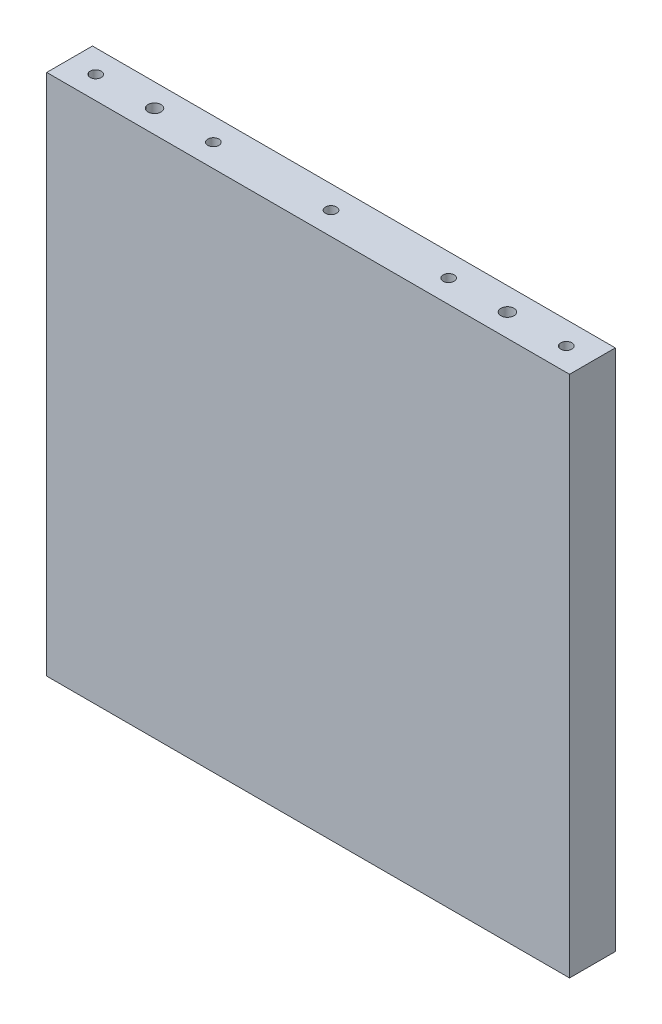
ISO-10303-21;
HEADER;
FILE_DESCRIPTION(('STEP AP214'),'2;1');
FILE_NAME('part.step','',(''),(''),'','','');
FILE_SCHEMA(('AUTOMOTIVE_DESIGN { 1 0 10303 214 1 1 1 1 }'));
ENDSEC;
DATA;
#1=APPLICATION_CONTEXT('core data for automotive mechanical design processes');
#2=APPLICATION_PROTOCOL_DEFINITION('international standard','automotive_design',2000,#1);
#3=PRODUCT_CONTEXT('',#1,'mechanical');
#4=PRODUCT('Part','Part','',(#3));
#5=PRODUCT_RELATED_PRODUCT_CATEGORY('part','',(#4));
#6=PRODUCT_DEFINITION_FORMATION('','',#4);
#7=PRODUCT_DEFINITION_CONTEXT('part definition',#1,'design');
#8=PRODUCT_DEFINITION('design','',#6,#7);
#9=PRODUCT_DEFINITION_SHAPE('','',#8);
#10=(LENGTH_UNIT() NAMED_UNIT(*) SI_UNIT(.MILLI.,.METRE.));
#11=(NAMED_UNIT(*) PLANE_ANGLE_UNIT() SI_UNIT($,.RADIAN.));
#12=(NAMED_UNIT(*) SI_UNIT($,.STERADIAN.) SOLID_ANGLE_UNIT());
#13=UNCERTAINTY_MEASURE_WITH_UNIT(LENGTH_MEASURE(1.E-05),#10,'distance_accuracy_value','');
#14=(GEOMETRIC_REPRESENTATION_CONTEXT(3) GLOBAL_UNCERTAINTY_ASSIGNED_CONTEXT((#13)) GLOBAL_UNIT_ASSIGNED_CONTEXT((#10,
#11,#12)) REPRESENTATION_CONTEXT('',''));
#15=CARTESIAN_POINT('',(0.,0.,0.));
#16=DIRECTION('',(0.,0.,1.));
#17=DIRECTION('',(1.,0.,0.));
#18=AXIS2_PLACEMENT_3D('',#15,#16,#17);
#19=CARTESIAN_POINT('',(-200.,200.,35.));
#20=DIRECTION('',(1.,0.,0.));
#21=DIRECTION('',(0.,1.,0.));
#22=AXIS2_PLACEMENT_3D('',#19,#20,#21);
#23=PLANE('',#22);
#24=DIRECTION('',(0.,-1.,0.));
#25=VECTOR('',#24,1.);
#26=CARTESIAN_POINT('',(-200.,200.,0.));
#27=LINE('',#26,#25);
#28=CARTESIAN_POINT('',(-200.,200.,0.));
#29=VERTEX_POINT('',#28);
#30=CARTESIAN_POINT('',(-200.,-200.,0.));
#31=VERTEX_POINT('',#30);
#32=EDGE_CURVE('E255',#29,#31,#27,.T.);
#33=ORIENTED_EDGE('',*,*,#32,.T.);
#34=DIRECTION('',(0.,0.,-1.));
#35=VECTOR('',#34,1.);
#36=CARTESIAN_POINT('',(-200.,-200.,35.));
#37=LINE('',#36,#35);
#38=CARTESIAN_POINT('',(-200.,-200.,35.));
#39=VERTEX_POINT('',#38);
#40=EDGE_CURVE('E11',#39,#31,#37,.T.);
#41=ORIENTED_EDGE('',*,*,#40,.F.);
#42=DIRECTION('',(0.,-1.,0.));
#43=VECTOR('',#42,1.);
#44=CARTESIAN_POINT('',(-200.,200.,35.));
#45=LINE('',#44,#43);
#46=CARTESIAN_POINT('',(-200.,200.,35.));
#47=VERTEX_POINT('',#46);
#48=EDGE_CURVE('E256',#47,#39,#45,.T.);
#49=ORIENTED_EDGE('',*,*,#48,.F.);
#50=DIRECTION('',(0.,0.,-1.));
#51=VECTOR('',#50,1.);
#52=CARTESIAN_POINT('',(-200.,200.,35.));
#53=LINE('',#52,#51);
#54=EDGE_CURVE('E266',#47,#29,#53,.T.);
#55=ORIENTED_EDGE('',*,*,#54,.T.);
#56=EDGE_LOOP('',(#33,#41,#49,#55));
#57=FACE_BOUND('',#56,.T.);
#58=ADVANCED_FACE('F43',(#57),#23,.F.);
#59=CARTESIAN_POINT('',(-200.,-200.,35.));
#60=DIRECTION('',(0.,1.,0.));
#61=DIRECTION('',(0.,0.,1.));
#62=AXIS2_PLACEMENT_3D('',#59,#60,#61);
#63=PLANE('',#62);
#64=CARTESIAN_POINT('',(-135.,-200.,17.5));
#65=DIRECTION('',(0.,-1.,0.));
#66=DIRECTION('',(0.,0.,-1.));
#67=AXIS2_PLACEMENT_3D('',#64,#65,#66);
#68=CIRCLE('',#67,5.);
#69=CARTESIAN_POINT('',(-135.,-200.,12.5));
#70=VERTEX_POINT('',#69);
#71=EDGE_CURVE('E159',#70,#70,#68,.T.);
#72=ORIENTED_EDGE('',*,*,#71,.F.);
#73=EDGE_LOOP('',(#72));
#74=FACE_BOUND('',#73,.T.);
#75=CARTESIAN_POINT('',(135.,-200.,17.5));
#76=DIRECTION('',(0.,-1.,0.));
#77=DIRECTION('',(0.,0.,-1.));
#78=AXIS2_PLACEMENT_3D('',#75,#76,#77);
#79=CIRCLE('',#78,5.);
#80=CARTESIAN_POINT('',(135.,-200.,12.5));
#81=VERTEX_POINT('',#80);
#82=EDGE_CURVE('E167',#81,#81,#79,.T.);
#83=ORIENTED_EDGE('',*,*,#82,.F.);
#84=EDGE_LOOP('',(#83));
#85=FACE_BOUND('',#84,.T.);
#86=CARTESIAN_POINT('',(-180.,-200.,17.5));
#87=DIRECTION('',(0.,-1.,0.));
#88=DIRECTION('',(0.,0.,-1.));
#89=AXIS2_PLACEMENT_3D('',#86,#87,#88);
#90=CIRCLE('',#89,4.24999999999998);
#91=CARTESIAN_POINT('',(-180.,-200.,13.25));
#92=VERTEX_POINT('',#91);
#93=EDGE_CURVE('E175',#92,#92,#90,.T.);
#94=ORIENTED_EDGE('',*,*,#93,.F.);
#95=EDGE_LOOP('',(#94));
#96=FACE_BOUND('',#95,.T.);
#97=CARTESIAN_POINT('',(-90.,-200.,17.5));
#98=DIRECTION('',(0.,-1.,0.));
#99=DIRECTION('',(0.,0.,-1.));
#100=AXIS2_PLACEMENT_3D('',#97,#98,#99);
#101=CIRCLE('',#100,4.24999999999999);
#102=CARTESIAN_POINT('',(-90.,-200.,13.25));
#103=VERTEX_POINT('',#102);
#104=EDGE_CURVE('E183',#103,#103,#101,.T.);
#105=ORIENTED_EDGE('',*,*,#104,.F.);
#106=EDGE_LOOP('',(#105));
#107=FACE_BOUND('',#106,.T.);
#108=CARTESIAN_POINT('',(0.,-200.,17.5));
#109=DIRECTION('',(0.,-1.,0.));
#110=DIRECTION('',(0.,0.,-1.));
#111=AXIS2_PLACEMENT_3D('',#108,#109,#110);
#112=CIRCLE('',#111,4.24999999999999);
#113=CARTESIAN_POINT('',(0.,-200.,13.25));
#114=VERTEX_POINT('',#113);
#115=EDGE_CURVE('E191',#114,#114,#112,.T.);
#116=ORIENTED_EDGE('',*,*,#115,.F.);
#117=EDGE_LOOP('',(#116));
#118=FACE_BOUND('',#117,.T.);
#119=CARTESIAN_POINT('',(90.0000000000001,-200.,17.5));
#120=DIRECTION('',(0.,-1.,0.));
#121=DIRECTION('',(0.,0.,-1.));
#122=AXIS2_PLACEMENT_3D('',#119,#120,#121);
#123=CIRCLE('',#122,4.24999999999999);
#124=CARTESIAN_POINT('',(90.0000000000001,-200.,13.25));
#125=VERTEX_POINT('',#124);
#126=EDGE_CURVE('E199',#125,#125,#123,.T.);
#127=ORIENTED_EDGE('',*,*,#126,.F.);
#128=EDGE_LOOP('',(#127));
#129=FACE_BOUND('',#128,.T.);
#130=CARTESIAN_POINT('',(180.,-200.,17.5));
#131=DIRECTION('',(0.,-1.,0.));
#132=DIRECTION('',(0.,0.,-1.));
#133=AXIS2_PLACEMENT_3D('',#130,#131,#132);
#134=CIRCLE('',#133,4.24999999999998);
#135=CARTESIAN_POINT('',(180.,-200.,13.25));
#136=VERTEX_POINT('',#135);
#137=EDGE_CURVE('E207',#136,#136,#134,.T.);
#138=ORIENTED_EDGE('',*,*,#137,.F.);
#139=EDGE_LOOP('',(#138));
#140=FACE_BOUND('',#139,.T.);
#141=DIRECTION('',(1.,0.,0.));
#142=VECTOR('',#141,1.);
#143=CARTESIAN_POINT('',(-200.,-200.,0.));
#144=LINE('',#143,#142);
#145=CARTESIAN_POINT('',(200.,-200.,0.));
#146=VERTEX_POINT('',#145);
#147=EDGE_CURVE('E270',#31,#146,#144,.T.);
#148=ORIENTED_EDGE('',*,*,#147,.T.);
#149=DIRECTION('',(0.,0.,-1.));
#150=VECTOR('',#149,1.);
#151=CARTESIAN_POINT('',(200.,-200.,35.));
#152=LINE('',#151,#150);
#153=CARTESIAN_POINT('',(200.,-200.,35.));
#154=VERTEX_POINT('',#153);
#155=EDGE_CURVE('E52',#154,#146,#152,.T.);
#156=ORIENTED_EDGE('',*,*,#155,.F.);
#157=DIRECTION('',(1.,0.,0.));
#158=VECTOR('',#157,1.);
#159=CARTESIAN_POINT('',(-200.,-200.,35.));
#160=LINE('',#159,#158);
#161=EDGE_CURVE('E91',#39,#154,#160,.T.);
#162=ORIENTED_EDGE('',*,*,#161,.F.);
#163=ORIENTED_EDGE('',*,*,#40,.T.);
#164=EDGE_LOOP('',(#148,#156,#162,#163));
#165=FACE_BOUND('',#164,.T.);
#166=ADVANCED_FACE('F300',(#74,#85,#96,#107,#118,#129,#140,#165),#63,.F.);
#167=CARTESIAN_POINT('',(200.,200.,35.));
#168=DIRECTION('',(-1.,0.,0.));
#169=DIRECTION('',(0.,-1.,0.));
#170=AXIS2_PLACEMENT_3D('',#167,#168,#169);
#171=PLANE('',#170);
#172=DIRECTION('',(0.,1.,0.));
#173=VECTOR('',#172,1.);
#174=CARTESIAN_POINT('',(200.,200.,0.));
#175=LINE('',#174,#173);
#176=CARTESIAN_POINT('',(200.,200.,0.));
#177=VERTEX_POINT('',#176);
#178=EDGE_CURVE('E78',#146,#177,#175,.T.);
#179=ORIENTED_EDGE('',*,*,#178,.T.);
#180=DIRECTION('',(0.,0.,-1.));
#181=VECTOR('',#180,1.);
#182=CARTESIAN_POINT('',(200.,200.,35.));
#183=LINE('',#182,#181);
#184=CARTESIAN_POINT('',(200.,200.,35.));
#185=VERTEX_POINT('',#184);
#186=EDGE_CURVE('E279',#185,#177,#183,.T.);
#187=ORIENTED_EDGE('',*,*,#186,.F.);
#188=DIRECTION('',(0.,1.,0.));
#189=VECTOR('',#188,1.);
#190=CARTESIAN_POINT('',(200.,200.,35.));
#191=LINE('',#190,#189);
#192=EDGE_CURVE('E261',#154,#185,#191,.T.);
#193=ORIENTED_EDGE('',*,*,#192,.F.);
#194=ORIENTED_EDGE('',*,*,#155,.T.);
#195=EDGE_LOOP('',(#179,#187,#193,#194));
#196=FACE_BOUND('',#195,.T.);
#197=ADVANCED_FACE('F283',(#196),#171,.F.);
#198=CARTESIAN_POINT('',(-200.,200.,35.));
#199=DIRECTION('',(0.,-1.,0.));
#200=DIRECTION('',(0.,0.,-1.));
#201=AXIS2_PLACEMENT_3D('',#198,#199,#200);
#202=PLANE('',#201);
#203=CARTESIAN_POINT('',(-135.,200.,17.5));
#204=DIRECTION('',(0.,1.,0.));
#205=DIRECTION('',(0.,0.,1.));
#206=AXIS2_PLACEMENT_3D('',#203,#204,#205);
#207=CIRCLE('',#206,4.99999999999998);
#208=CARTESIAN_POINT('',(-135.,200.,22.5));
#209=VERTEX_POINT('',#208);
#210=EDGE_CURVE('E146',#209,#209,#207,.T.);
#211=ORIENTED_EDGE('',*,*,#210,.F.);
#212=EDGE_LOOP('',(#211));
#213=FACE_BOUND('',#212,.T.);
#214=CARTESIAN_POINT('',(135.,200.,17.5));
#215=DIRECTION('',(0.,1.,0.));
#216=DIRECTION('',(0.,0.,1.));
#217=AXIS2_PLACEMENT_3D('',#214,#215,#216);
#218=CIRCLE('',#217,4.99999999999998);
#219=CARTESIAN_POINT('',(135.,200.,22.5));
#220=VERTEX_POINT('',#219);
#221=EDGE_CURVE('E145',#220,#220,#218,.T.);
#222=ORIENTED_EDGE('',*,*,#221,.F.);
#223=EDGE_LOOP('',(#222));
#224=FACE_BOUND('',#223,.T.);
#225=CARTESIAN_POINT('',(-180.,200.,17.5));
#226=DIRECTION('',(0.,1.,0.));
#227=DIRECTION('',(0.,0.,1.));
#228=AXIS2_PLACEMENT_3D('',#225,#226,#227);
#229=CIRCLE('',#228,4.25);
#230=CARTESIAN_POINT('',(-180.,200.,21.75));
#231=VERTEX_POINT('',#230);
#232=EDGE_CURVE('E215',#231,#231,#229,.T.);
#233=ORIENTED_EDGE('',*,*,#232,.F.);
#234=EDGE_LOOP('',(#233));
#235=FACE_BOUND('',#234,.T.);
#236=CARTESIAN_POINT('',(-90.0000000000001,200.,17.5));
#237=DIRECTION('',(0.,1.,0.));
#238=DIRECTION('',(0.,0.,1.));
#239=AXIS2_PLACEMENT_3D('',#236,#237,#238);
#240=CIRCLE('',#239,4.25);
#241=CARTESIAN_POINT('',(-90.0000000000001,200.,21.75));
#242=VERTEX_POINT('',#241);
#243=EDGE_CURVE('E223',#242,#242,#240,.T.);
#244=ORIENTED_EDGE('',*,*,#243,.F.);
#245=EDGE_LOOP('',(#244));
#246=FACE_BOUND('',#245,.T.);
#247=CARTESIAN_POINT('',(0.,200.,17.5));
#248=DIRECTION('',(0.,1.,0.));
#249=DIRECTION('',(0.,0.,1.));
#250=AXIS2_PLACEMENT_3D('',#247,#248,#249);
#251=CIRCLE('',#250,4.25);
#252=CARTESIAN_POINT('',(0.,200.,21.75));
#253=VERTEX_POINT('',#252);
#254=EDGE_CURVE('E231',#253,#253,#251,.T.);
#255=ORIENTED_EDGE('',*,*,#254,.F.);
#256=EDGE_LOOP('',(#255));
#257=FACE_BOUND('',#256,.T.);
#258=CARTESIAN_POINT('',(90.,200.,17.5));
#259=DIRECTION('',(0.,1.,0.));
#260=DIRECTION('',(0.,0.,1.));
#261=AXIS2_PLACEMENT_3D('',#258,#259,#260);
#262=CIRCLE('',#261,4.25);
#263=CARTESIAN_POINT('',(90.,200.,21.75));
#264=VERTEX_POINT('',#263);
#265=EDGE_CURVE('E239',#264,#264,#262,.T.);
#266=ORIENTED_EDGE('',*,*,#265,.F.);
#267=EDGE_LOOP('',(#266));
#268=FACE_BOUND('',#267,.T.);
#269=CARTESIAN_POINT('',(180.,200.,17.5));
#270=DIRECTION('',(0.,1.,0.));
#271=DIRECTION('',(0.,0.,1.));
#272=AXIS2_PLACEMENT_3D('',#269,#270,#271);
#273=CIRCLE('',#272,4.25);
#274=CARTESIAN_POINT('',(180.,200.,21.75));
#275=VERTEX_POINT('',#274);
#276=EDGE_CURVE('E247',#275,#275,#273,.T.);
#277=ORIENTED_EDGE('',*,*,#276,.F.);
#278=EDGE_LOOP('',(#277));
#279=FACE_BOUND('',#278,.T.);
#280=DIRECTION('',(-1.,0.,0.));
#281=VECTOR('',#280,1.);
#282=CARTESIAN_POINT('',(-200.,200.,0.));
#283=LINE('',#282,#281);
#284=EDGE_CURVE('E84',#177,#29,#283,.T.);
#285=ORIENTED_EDGE('',*,*,#284,.T.);
#286=ORIENTED_EDGE('',*,*,#54,.F.);
#287=DIRECTION('',(-1.,0.,0.));
#288=VECTOR('',#287,1.);
#289=CARTESIAN_POINT('',(-200.,200.,35.));
#290=LINE('',#289,#288);
#291=EDGE_CURVE('E60',#185,#47,#290,.T.);
#292=ORIENTED_EDGE('',*,*,#291,.F.);
#293=ORIENTED_EDGE('',*,*,#186,.T.);
#294=EDGE_LOOP('',(#285,#286,#292,#293));
#295=FACE_BOUND('',#294,.T.);
#296=ADVANCED_FACE('F290',(#213,#224,#235,#246,#257,#268,#279,#295),#202,.F.);
#297=CARTESIAN_POINT('',(0.,0.,35.));
#298=DIRECTION('',(0.,0.,1.));
#299=DIRECTION('',(1.,0.,0.));
#300=AXIS2_PLACEMENT_3D('',#297,#298,#299);
#301=PLANE('',#300);
#302=ORIENTED_EDGE('',*,*,#48,.T.);
#303=ORIENTED_EDGE('',*,*,#161,.T.);
#304=ORIENTED_EDGE('',*,*,#192,.T.);
#305=ORIENTED_EDGE('',*,*,#291,.T.);
#306=EDGE_LOOP('',(#302,#303,#304,#305));
#307=FACE_BOUND('',#306,.T.);
#308=ADVANCED_FACE('F292',(#307),#301,.T.);
#309=CARTESIAN_POINT('',(0.,0.,0.));
#310=DIRECTION('',(0.,0.,1.));
#311=DIRECTION('',(1.,0.,0.));
#312=AXIS2_PLACEMENT_3D('',#309,#310,#311);
#313=PLANE('',#312);
#314=ORIENTED_EDGE('',*,*,#32,.F.);
#315=ORIENTED_EDGE('',*,*,#284,.F.);
#316=ORIENTED_EDGE('',*,*,#178,.F.);
#317=ORIENTED_EDGE('',*,*,#147,.F.);
#318=EDGE_LOOP('',(#314,#315,#316,#317));
#319=FACE_BOUND('',#318,.T.);
#320=ADVANCED_FACE('F286',(#319),#313,.F.);
#321=CARTESIAN_POINT('',(180.,172.5,17.5));
#322=DIRECTION('',(0.,1.,0.));
#323=DIRECTION('',(0.,0.,1.));
#324=AXIS2_PLACEMENT_3D('',#321,#322,#323);
#325=CONICAL_SURFACE('',#324,4.25,1.02974425867665);
#326=CARTESIAN_POINT('',(180.,169.946342369133,17.5));
#327=VERTEX_POINT('',#326);
#328=VERTEX_LOOP('',#327);
#329=FACE_BOUND('',#328,.T.);
#330=CARTESIAN_POINT('',(180.,172.5,17.5));
#331=DIRECTION('',(0.,1.,0.));
#332=DIRECTION('',(0.,0.,1.));
#333=AXIS2_PLACEMENT_3D('',#330,#331,#332);
#334=CIRCLE('',#333,4.25);
#335=CARTESIAN_POINT('',(180.,172.5,21.75));
#336=VERTEX_POINT('',#335);
#337=EDGE_CURVE('E251',#336,#336,#334,.T.);
#338=ORIENTED_EDGE('',*,*,#337,.T.);
#339=EDGE_LOOP('',(#338));
#340=FACE_BOUND('',#339,.T.);
#341=ADVANCED_FACE('F379',(#329,#340),#325,.F.);
#342=CARTESIAN_POINT('',(180.,200.,17.5));
#343=DIRECTION('',(0.,1.,0.));
#344=DIRECTION('',(0.,0.,1.));
#345=AXIS2_PLACEMENT_3D('',#342,#343,#344);
#346=CYLINDRICAL_SURFACE('',#345,4.25);
#347=ORIENTED_EDGE('',*,*,#337,.F.);
#348=EDGE_LOOP('',(#347));
#349=FACE_BOUND('',#348,.T.);
#350=ORIENTED_EDGE('',*,*,#276,.T.);
#351=EDGE_LOOP('',(#350));
#352=FACE_BOUND('',#351,.T.);
#353=ADVANCED_FACE('F375',(#349,#352),#346,.F.);
#354=CARTESIAN_POINT('',(90.,172.5,17.5));
#355=DIRECTION('',(0.,1.,0.));
#356=DIRECTION('',(0.,0.,1.));
#357=AXIS2_PLACEMENT_3D('',#354,#355,#356);
#358=CONICAL_SURFACE('',#357,4.25,1.02974425867665);
#359=CARTESIAN_POINT('',(90.,169.946342369133,17.5));
#360=VERTEX_POINT('',#359);
#361=VERTEX_LOOP('',#360);
#362=FACE_BOUND('',#361,.T.);
#363=CARTESIAN_POINT('',(90.,172.5,17.5));
#364=DIRECTION('',(0.,1.,0.));
#365=DIRECTION('',(0.,0.,1.));
#366=AXIS2_PLACEMENT_3D('',#363,#364,#365);
#367=CIRCLE('',#366,4.25);
#368=CARTESIAN_POINT('',(90.,172.5,21.75));
#369=VERTEX_POINT('',#368);
#370=EDGE_CURVE('E243',#369,#369,#367,.T.);
#371=ORIENTED_EDGE('',*,*,#370,.T.);
#372=EDGE_LOOP('',(#371));
#373=FACE_BOUND('',#372,.T.);
#374=ADVANCED_FACE('F371',(#362,#373),#358,.F.);
#375=CARTESIAN_POINT('',(90.,200.,17.5));
#376=DIRECTION('',(0.,1.,0.));
#377=DIRECTION('',(0.,0.,1.));
#378=AXIS2_PLACEMENT_3D('',#375,#376,#377);
#379=CYLINDRICAL_SURFACE('',#378,4.25);
#380=ORIENTED_EDGE('',*,*,#370,.F.);
#381=EDGE_LOOP('',(#380));
#382=FACE_BOUND('',#381,.T.);
#383=ORIENTED_EDGE('',*,*,#265,.T.);
#384=EDGE_LOOP('',(#383));
#385=FACE_BOUND('',#384,.T.);
#386=ADVANCED_FACE('F367',(#382,#385),#379,.F.);
#387=CARTESIAN_POINT('',(0.,172.5,17.5));
#388=DIRECTION('',(0.,1.,0.));
#389=DIRECTION('',(0.,0.,1.));
#390=AXIS2_PLACEMENT_3D('',#387,#388,#389);
#391=CONICAL_SURFACE('',#390,4.25,1.02974425867665);
#392=CARTESIAN_POINT('',(0.,169.946342369133,17.5));
#393=VERTEX_POINT('',#392);
#394=VERTEX_LOOP('',#393);
#395=FACE_BOUND('',#394,.T.);
#396=CARTESIAN_POINT('',(0.,172.5,17.5));
#397=DIRECTION('',(0.,1.,0.));
#398=DIRECTION('',(0.,0.,1.));
#399=AXIS2_PLACEMENT_3D('',#396,#397,#398);
#400=CIRCLE('',#399,4.25);
#401=CARTESIAN_POINT('',(0.,172.5,21.75));
#402=VERTEX_POINT('',#401);
#403=EDGE_CURVE('E235',#402,#402,#400,.T.);
#404=ORIENTED_EDGE('',*,*,#403,.T.);
#405=EDGE_LOOP('',(#404));
#406=FACE_BOUND('',#405,.T.);
#407=ADVANCED_FACE('F363',(#395,#406),#391,.F.);
#408=CARTESIAN_POINT('',(0.,200.,17.5));
#409=DIRECTION('',(0.,1.,0.));
#410=DIRECTION('',(0.,0.,1.));
#411=AXIS2_PLACEMENT_3D('',#408,#409,#410);
#412=CYLINDRICAL_SURFACE('',#411,4.25);
#413=ORIENTED_EDGE('',*,*,#403,.F.);
#414=EDGE_LOOP('',(#413));
#415=FACE_BOUND('',#414,.T.);
#416=ORIENTED_EDGE('',*,*,#254,.T.);
#417=EDGE_LOOP('',(#416));
#418=FACE_BOUND('',#417,.T.);
#419=ADVANCED_FACE('F359',(#415,#418),#412,.F.);
#420=CARTESIAN_POINT('',(-90.0000000000001,172.5,17.5));
#421=DIRECTION('',(0.,1.,0.));
#422=DIRECTION('',(0.,0.,1.));
#423=AXIS2_PLACEMENT_3D('',#420,#421,#422);
#424=CONICAL_SURFACE('',#423,4.25,1.02974425867665);
#425=CARTESIAN_POINT('',(-90.0000000000001,169.946342369133,17.5));
#426=VERTEX_POINT('',#425);
#427=VERTEX_LOOP('',#426);
#428=FACE_BOUND('',#427,.T.);
#429=CARTESIAN_POINT('',(-90.0000000000001,172.5,17.5));
#430=DIRECTION('',(0.,1.,0.));
#431=DIRECTION('',(0.,0.,1.));
#432=AXIS2_PLACEMENT_3D('',#429,#430,#431);
#433=CIRCLE('',#432,4.25);
#434=CARTESIAN_POINT('',(-90.0000000000001,172.5,21.75));
#435=VERTEX_POINT('',#434);
#436=EDGE_CURVE('E227',#435,#435,#433,.T.);
#437=ORIENTED_EDGE('',*,*,#436,.T.);
#438=EDGE_LOOP('',(#437));
#439=FACE_BOUND('',#438,.T.);
#440=ADVANCED_FACE('F355',(#428,#439),#424,.F.);
#441=CARTESIAN_POINT('',(-90.0000000000001,200.,17.5));
#442=DIRECTION('',(0.,1.,0.));
#443=DIRECTION('',(0.,0.,1.));
#444=AXIS2_PLACEMENT_3D('',#441,#442,#443);
#445=CYLINDRICAL_SURFACE('',#444,4.25);
#446=ORIENTED_EDGE('',*,*,#436,.F.);
#447=EDGE_LOOP('',(#446));
#448=FACE_BOUND('',#447,.T.);
#449=ORIENTED_EDGE('',*,*,#243,.T.);
#450=EDGE_LOOP('',(#449));
#451=FACE_BOUND('',#450,.T.);
#452=ADVANCED_FACE('F351',(#448,#451),#445,.F.);
#453=CARTESIAN_POINT('',(-180.,172.5,17.5));
#454=DIRECTION('',(0.,1.,0.));
#455=DIRECTION('',(0.,0.,1.));
#456=AXIS2_PLACEMENT_3D('',#453,#454,#455);
#457=CONICAL_SURFACE('',#456,4.25,1.02974425867665);
#458=CARTESIAN_POINT('',(-180.,169.946342369133,17.5));
#459=VERTEX_POINT('',#458);
#460=VERTEX_LOOP('',#459);
#461=FACE_BOUND('',#460,.T.);
#462=CARTESIAN_POINT('',(-180.,172.5,17.5));
#463=DIRECTION('',(0.,1.,0.));
#464=DIRECTION('',(0.,0.,1.));
#465=AXIS2_PLACEMENT_3D('',#462,#463,#464);
#466=CIRCLE('',#465,4.25);
#467=CARTESIAN_POINT('',(-180.,172.5,21.75));
#468=VERTEX_POINT('',#467);
#469=EDGE_CURVE('E219',#468,#468,#466,.T.);
#470=ORIENTED_EDGE('',*,*,#469,.T.);
#471=EDGE_LOOP('',(#470));
#472=FACE_BOUND('',#471,.T.);
#473=ADVANCED_FACE('F347',(#461,#472),#457,.F.);
#474=CARTESIAN_POINT('',(-180.,200.,17.5));
#475=DIRECTION('',(0.,1.,0.));
#476=DIRECTION('',(0.,0.,1.));
#477=AXIS2_PLACEMENT_3D('',#474,#475,#476);
#478=CYLINDRICAL_SURFACE('',#477,4.25);
#479=ORIENTED_EDGE('',*,*,#469,.F.);
#480=EDGE_LOOP('',(#479));
#481=FACE_BOUND('',#480,.T.);
#482=ORIENTED_EDGE('',*,*,#232,.T.);
#483=EDGE_LOOP('',(#482));
#484=FACE_BOUND('',#483,.T.);
#485=ADVANCED_FACE('F339',(#481,#484),#478,.F.);
#486=CARTESIAN_POINT('',(180.,-172.5,17.5));
#487=DIRECTION('',(0.,-1.,0.));
#488=DIRECTION('',(0.,0.,-1.));
#489=AXIS2_PLACEMENT_3D('',#486,#487,#488);
#490=CONICAL_SURFACE('',#489,4.24999999999998,1.02974425867665);
#491=CARTESIAN_POINT('',(180.,-169.946342369133,17.5));
#492=VERTEX_POINT('',#491);
#493=VERTEX_LOOP('',#492);
#494=FACE_BOUND('',#493,.T.);
#495=CARTESIAN_POINT('',(180.,-172.5,17.5));
#496=DIRECTION('',(0.,-1.,0.));
#497=DIRECTION('',(0.,0.,-1.));
#498=AXIS2_PLACEMENT_3D('',#495,#496,#497);
#499=CIRCLE('',#498,4.24999999999998);
#500=CARTESIAN_POINT('',(180.,-172.5,13.25));
#501=VERTEX_POINT('',#500);
#502=EDGE_CURVE('E211',#501,#501,#499,.T.);
#503=ORIENTED_EDGE('',*,*,#502,.T.);
#504=EDGE_LOOP('',(#503));
#505=FACE_BOUND('',#504,.T.);
#506=ADVANCED_FACE('F329',(#494,#505),#490,.F.);
#507=CARTESIAN_POINT('',(180.,-200.,17.5));
#508=DIRECTION('',(0.,-1.,0.));
#509=DIRECTION('',(0.,0.,-1.));
#510=AXIS2_PLACEMENT_3D('',#507,#508,#509);
#511=CYLINDRICAL_SURFACE('',#510,4.24999999999998);
#512=ORIENTED_EDGE('',*,*,#502,.F.);
#513=EDGE_LOOP('',(#512));
#514=FACE_BOUND('',#513,.T.);
#515=ORIENTED_EDGE('',*,*,#137,.T.);
#516=EDGE_LOOP('',(#515));
#517=FACE_BOUND('',#516,.T.);
#518=ADVANCED_FACE('F326',(#514,#517),#511,.F.);
#519=CARTESIAN_POINT('',(90.0000000000001,-172.5,17.5));
#520=DIRECTION('',(0.,-1.,0.));
#521=DIRECTION('',(0.,0.,-1.));
#522=AXIS2_PLACEMENT_3D('',#519,#520,#521);
#523=CONICAL_SURFACE('',#522,4.24999999999999,1.02974425867665);
#524=CARTESIAN_POINT('',(90.,-169.946342369133,17.5));
#525=VERTEX_POINT('',#524);
#526=VERTEX_LOOP('',#525);
#527=FACE_BOUND('',#526,.T.);
#528=CARTESIAN_POINT('',(90.0000000000001,-172.5,17.5));
#529=DIRECTION('',(0.,-1.,0.));
#530=DIRECTION('',(0.,0.,-1.));
#531=AXIS2_PLACEMENT_3D('',#528,#529,#530);
#532=CIRCLE('',#531,4.24999999999999);
#533=CARTESIAN_POINT('',(90.0000000000001,-172.5,13.25));
#534=VERTEX_POINT('',#533);
#535=EDGE_CURVE('E203',#534,#534,#532,.T.);
#536=ORIENTED_EDGE('',*,*,#535,.T.);
#537=EDGE_LOOP('',(#536));
#538=FACE_BOUND('',#537,.T.);
#539=ADVANCED_FACE('F328',(#527,#538),#523,.F.);
#540=CARTESIAN_POINT('',(90.0000000000001,-200.,17.5));
#541=DIRECTION('',(0.,-1.,0.));
#542=DIRECTION('',(0.,0.,-1.));
#543=AXIS2_PLACEMENT_3D('',#540,#541,#542);
#544=CYLINDRICAL_SURFACE('',#543,4.24999999999999);
#545=ORIENTED_EDGE('',*,*,#535,.F.);
#546=EDGE_LOOP('',(#545));
#547=FACE_BOUND('',#546,.T.);
#548=ORIENTED_EDGE('',*,*,#126,.T.);
#549=EDGE_LOOP('',(#548));
#550=FACE_BOUND('',#549,.T.);
#551=ADVANCED_FACE('F336',(#547,#550),#544,.F.);
#552=CARTESIAN_POINT('',(0.,-172.5,17.5));
#553=DIRECTION('',(0.,-1.,0.));
#554=DIRECTION('',(0.,0.,-1.));
#555=AXIS2_PLACEMENT_3D('',#552,#553,#554);
#556=CONICAL_SURFACE('',#555,4.24999999999999,1.02974425867665);
#557=CARTESIAN_POINT('',(0.,-169.946342369133,17.5));
#558=VERTEX_POINT('',#557);
#559=VERTEX_LOOP('',#558);
#560=FACE_BOUND('',#559,.T.);
#561=CARTESIAN_POINT('',(0.,-172.5,17.5));
#562=DIRECTION('',(0.,-1.,0.));
#563=DIRECTION('',(0.,0.,-1.));
#564=AXIS2_PLACEMENT_3D('',#561,#562,#563);
#565=CIRCLE('',#564,4.24999999999999);
#566=CARTESIAN_POINT('',(0.,-172.5,13.25));
#567=VERTEX_POINT('',#566);
#568=EDGE_CURVE('E195',#567,#567,#565,.T.);
#569=ORIENTED_EDGE('',*,*,#568,.T.);
#570=EDGE_LOOP('',(#569));
#571=FACE_BOUND('',#570,.T.);
#572=ADVANCED_FACE('F451',(#560,#571),#556,.F.);
#573=CARTESIAN_POINT('',(0.,-200.,17.5));
#574=DIRECTION('',(0.,-1.,0.));
#575=DIRECTION('',(0.,0.,-1.));
#576=AXIS2_PLACEMENT_3D('',#573,#574,#575);
#577=CYLINDRICAL_SURFACE('',#576,4.24999999999999);
#578=ORIENTED_EDGE('',*,*,#568,.F.);
#579=EDGE_LOOP('',(#578));
#580=FACE_BOUND('',#579,.T.);
#581=ORIENTED_EDGE('',*,*,#115,.T.);
#582=EDGE_LOOP('',(#581));
#583=FACE_BOUND('',#582,.T.);
#584=ADVANCED_FACE('F456',(#580,#583),#577,.F.);
#585=CARTESIAN_POINT('',(-90.,-172.5,17.5));
#586=DIRECTION('',(0.,-1.,0.));
#587=DIRECTION('',(0.,0.,-1.));
#588=AXIS2_PLACEMENT_3D('',#585,#586,#587);
#589=CONICAL_SURFACE('',#588,4.24999999999999,1.02974425867665);
#590=CARTESIAN_POINT('',(-90.,-169.946342369133,17.5));
#591=VERTEX_POINT('',#590);
#592=VERTEX_LOOP('',#591);
#593=FACE_BOUND('',#592,.T.);
#594=CARTESIAN_POINT('',(-90.,-172.5,17.5));
#595=DIRECTION('',(0.,-1.,0.));
#596=DIRECTION('',(0.,0.,-1.));
#597=AXIS2_PLACEMENT_3D('',#594,#595,#596);
#598=CIRCLE('',#597,4.24999999999999);
#599=CARTESIAN_POINT('',(-90.,-172.5,13.25));
#600=VERTEX_POINT('',#599);
#601=EDGE_CURVE('E187',#600,#600,#598,.T.);
#602=ORIENTED_EDGE('',*,*,#601,.T.);
#603=EDGE_LOOP('',(#602));
#604=FACE_BOUND('',#603,.T.);
#605=ADVANCED_FACE('F464',(#593,#604),#589,.F.);
#606=CARTESIAN_POINT('',(-90.,-200.,17.5));
#607=DIRECTION('',(0.,-1.,0.));
#608=DIRECTION('',(0.,0.,-1.));
#609=AXIS2_PLACEMENT_3D('',#606,#607,#608);
#610=CYLINDRICAL_SURFACE('',#609,4.24999999999999);
#611=ORIENTED_EDGE('',*,*,#601,.F.);
#612=EDGE_LOOP('',(#611));
#613=FACE_BOUND('',#612,.T.);
#614=ORIENTED_EDGE('',*,*,#104,.T.);
#615=EDGE_LOOP('',(#614));
#616=FACE_BOUND('',#615,.T.);
#617=ADVANCED_FACE('F468',(#613,#616),#610,.F.);
#618=CARTESIAN_POINT('',(-180.,-172.5,17.5));
#619=DIRECTION('',(0.,-1.,0.));
#620=DIRECTION('',(0.,0.,-1.));
#621=AXIS2_PLACEMENT_3D('',#618,#619,#620);
#622=CONICAL_SURFACE('',#621,4.24999999999998,1.02974425867665);
#623=CARTESIAN_POINT('',(-180.,-169.946342369133,17.5));
#624=VERTEX_POINT('',#623);
#625=VERTEX_LOOP('',#624);
#626=FACE_BOUND('',#625,.T.);
#627=CARTESIAN_POINT('',(-180.,-172.5,17.5));
#628=DIRECTION('',(0.,-1.,0.));
#629=DIRECTION('',(0.,0.,-1.));
#630=AXIS2_PLACEMENT_3D('',#627,#628,#629);
#631=CIRCLE('',#630,4.24999999999998);
#632=CARTESIAN_POINT('',(-180.,-172.5,13.25));
#633=VERTEX_POINT('',#632);
#634=EDGE_CURVE('E179',#633,#633,#631,.T.);
#635=ORIENTED_EDGE('',*,*,#634,.T.);
#636=EDGE_LOOP('',(#635));
#637=FACE_BOUND('',#636,.T.);
#638=ADVANCED_FACE('F476',(#626,#637),#622,.F.);
#639=CARTESIAN_POINT('',(-180.,-200.,17.5));
#640=DIRECTION('',(0.,-1.,0.));
#641=DIRECTION('',(0.,0.,-1.));
#642=AXIS2_PLACEMENT_3D('',#639,#640,#641);
#643=CYLINDRICAL_SURFACE('',#642,4.24999999999998);
#644=ORIENTED_EDGE('',*,*,#634,.F.);
#645=EDGE_LOOP('',(#644));
#646=FACE_BOUND('',#645,.T.);
#647=ORIENTED_EDGE('',*,*,#93,.T.);
#648=EDGE_LOOP('',(#647));
#649=FACE_BOUND('',#648,.T.);
#650=ADVANCED_FACE('F480',(#646,#649),#643,.F.);
#651=CARTESIAN_POINT('',(135.,-172.5,17.5));
#652=DIRECTION('',(0.,-1.,0.));
#653=DIRECTION('',(0.,0.,-1.));
#654=AXIS2_PLACEMENT_3D('',#651,#652,#653);
#655=CONICAL_SURFACE('',#654,5.,1.02974425867666);
#656=CARTESIAN_POINT('',(135.,-169.495696904862,17.5));
#657=VERTEX_POINT('',#656);
#658=VERTEX_LOOP('',#657);
#659=FACE_BOUND('',#658,.T.);
#660=CARTESIAN_POINT('',(135.,-172.5,17.5));
#661=DIRECTION('',(0.,-1.,0.));
#662=DIRECTION('',(0.,0.,-1.));
#663=AXIS2_PLACEMENT_3D('',#660,#661,#662);
#664=CIRCLE('',#663,5.);
#665=CARTESIAN_POINT('',(135.,-172.5,12.5));
#666=VERTEX_POINT('',#665);
#667=EDGE_CURVE('E171',#666,#666,#664,.T.);
#668=ORIENTED_EDGE('',*,*,#667,.T.);
#669=EDGE_LOOP('',(#668));
#670=FACE_BOUND('',#669,.T.);
#671=ADVANCED_FACE('F492',(#659,#670),#655,.F.);
#672=CARTESIAN_POINT('',(135.,-200.,17.5));
#673=DIRECTION('',(0.,-1.,0.));
#674=DIRECTION('',(0.,0.,-1.));
#675=AXIS2_PLACEMENT_3D('',#672,#673,#674);
#676=CYLINDRICAL_SURFACE('',#675,5.);
#677=ORIENTED_EDGE('',*,*,#667,.F.);
#678=EDGE_LOOP('',(#677));
#679=FACE_BOUND('',#678,.T.);
#680=ORIENTED_EDGE('',*,*,#82,.T.);
#681=EDGE_LOOP('',(#680));
#682=FACE_BOUND('',#681,.T.);
#683=ADVANCED_FACE('F500',(#679,#682),#676,.F.);
#684=CARTESIAN_POINT('',(-135.,-172.5,17.5));
#685=DIRECTION('',(0.,-1.,0.));
#686=DIRECTION('',(0.,0.,-1.));
#687=AXIS2_PLACEMENT_3D('',#684,#685,#686);
#688=CONICAL_SURFACE('',#687,5.,1.02974425867666);
#689=CARTESIAN_POINT('',(-135.,-169.495696904862,17.5));
#690=VERTEX_POINT('',#689);
#691=VERTEX_LOOP('',#690);
#692=FACE_BOUND('',#691,.T.);
#693=CARTESIAN_POINT('',(-135.,-172.5,17.5));
#694=DIRECTION('',(0.,-1.,0.));
#695=DIRECTION('',(0.,0.,-1.));
#696=AXIS2_PLACEMENT_3D('',#693,#694,#695);
#697=CIRCLE('',#696,5.);
#698=CARTESIAN_POINT('',(-135.,-172.5,12.5));
#699=VERTEX_POINT('',#698);
#700=EDGE_CURVE('E163',#699,#699,#697,.T.);
#701=ORIENTED_EDGE('',*,*,#700,.T.);
#702=EDGE_LOOP('',(#701));
#703=FACE_BOUND('',#702,.T.);
#704=ADVANCED_FACE('F509',(#692,#703),#688,.F.);
#705=CARTESIAN_POINT('',(-135.,-200.,17.5));
#706=DIRECTION('',(0.,-1.,0.));
#707=DIRECTION('',(0.,0.,-1.));
#708=AXIS2_PLACEMENT_3D('',#705,#706,#707);
#709=CYLINDRICAL_SURFACE('',#708,5.);
#710=ORIENTED_EDGE('',*,*,#700,.F.);
#711=EDGE_LOOP('',(#710));
#712=FACE_BOUND('',#711,.T.);
#713=ORIENTED_EDGE('',*,*,#71,.T.);
#714=EDGE_LOOP('',(#713));
#715=FACE_BOUND('',#714,.T.);
#716=ADVANCED_FACE('F517',(#712,#715),#709,.F.);
#717=CARTESIAN_POINT('',(135.,172.5,17.5));
#718=DIRECTION('',(0.,1.,0.));
#719=DIRECTION('',(0.,0.,1.));
#720=AXIS2_PLACEMENT_3D('',#717,#718,#719);
#721=CONICAL_SURFACE('',#720,4.99999999999998,1.02974425867665);
#722=CARTESIAN_POINT('',(135.,169.495696904862,17.5));
#723=VERTEX_POINT('',#722);
#724=VERTEX_LOOP('',#723);
#725=FACE_BOUND('',#724,.T.);
#726=CARTESIAN_POINT('',(135.,172.5,17.5));
#727=DIRECTION('',(0.,1.,0.));
#728=DIRECTION('',(0.,0.,1.));
#729=AXIS2_PLACEMENT_3D('',#726,#727,#728);
#730=CIRCLE('',#729,4.99999999999998);
#731=CARTESIAN_POINT('',(135.,172.5,22.5));
#732=VERTEX_POINT('',#731);
#733=EDGE_CURVE('E151',#732,#732,#730,.T.);
#734=ORIENTED_EDGE('',*,*,#733,.T.);
#735=EDGE_LOOP('',(#734));
#736=FACE_BOUND('',#735,.T.);
#737=ADVANCED_FACE('F525',(#725,#736),#721,.F.);
#738=CARTESIAN_POINT('',(135.,200.,17.5));
#739=DIRECTION('',(0.,1.,0.));
#740=DIRECTION('',(0.,0.,1.));
#741=AXIS2_PLACEMENT_3D('',#738,#739,#740);
#742=CYLINDRICAL_SURFACE('',#741,4.99999999999998);
#743=ORIENTED_EDGE('',*,*,#733,.F.);
#744=EDGE_LOOP('',(#743));
#745=FACE_BOUND('',#744,.T.);
#746=ORIENTED_EDGE('',*,*,#221,.T.);
#747=EDGE_LOOP('',(#746));
#748=FACE_BOUND('',#747,.T.);
#749=ADVANCED_FACE('F138',(#745,#748),#742,.F.);
#750=CARTESIAN_POINT('',(-135.,172.5,17.5));
#751=DIRECTION('',(0.,1.,0.));
#752=DIRECTION('',(0.,0.,1.));
#753=AXIS2_PLACEMENT_3D('',#750,#751,#752);
#754=CONICAL_SURFACE('',#753,4.99999999999998,1.02974425867665);
#755=CARTESIAN_POINT('',(-135.,169.495696904862,17.5));
#756=VERTEX_POINT('',#755);
#757=VERTEX_LOOP('',#756);
#758=FACE_BOUND('',#757,.T.);
#759=CARTESIAN_POINT('',(-135.,172.5,17.5));
#760=DIRECTION('',(0.,1.,0.));
#761=DIRECTION('',(0.,0.,1.));
#762=AXIS2_PLACEMENT_3D('',#759,#760,#761);
#763=CIRCLE('',#762,4.99999999999998);
#764=CARTESIAN_POINT('',(-135.,172.5,22.5));
#765=VERTEX_POINT('',#764);
#766=EDGE_CURVE('E142',#765,#765,#763,.T.);
#767=ORIENTED_EDGE('',*,*,#766,.T.);
#768=EDGE_LOOP('',(#767));
#769=FACE_BOUND('',#768,.T.);
#770=ADVANCED_FACE('F134',(#758,#769),#754,.F.);
#771=CARTESIAN_POINT('',(-135.,200.,17.5));
#772=DIRECTION('',(0.,1.,0.));
#773=DIRECTION('',(0.,0.,1.));
#774=AXIS2_PLACEMENT_3D('',#771,#772,#773);
#775=CYLINDRICAL_SURFACE('',#774,4.99999999999998);
#776=ORIENTED_EDGE('',*,*,#766,.F.);
#777=EDGE_LOOP('',(#776));
#778=FACE_BOUND('',#777,.T.);
#779=ORIENTED_EDGE('',*,*,#210,.T.);
#780=EDGE_LOOP('',(#779));
#781=FACE_BOUND('',#780,.T.);
#782=ADVANCED_FACE('F137',(#778,#781),#775,.F.);
#783=CLOSED_SHELL('',(#58,#166,#197,#296,#308,#320,#341,#353,#374,#386,#407,#419,#440,#452,#473,
#485,#506,#518,#539,#551,#572,#584,#605,#617,#638,#650,#671,#683,#704,#716,#737,#749,#770,#782));
#784=MANIFOLD_SOLID_BREP('B2',#783);
#785=ADVANCED_BREP_SHAPE_REPRESENTATION('',(#18,#784),#14);
#786=SHAPE_DEFINITION_REPRESENTATION(#9,#785);
ENDSEC;
END-ISO-10303-21;
